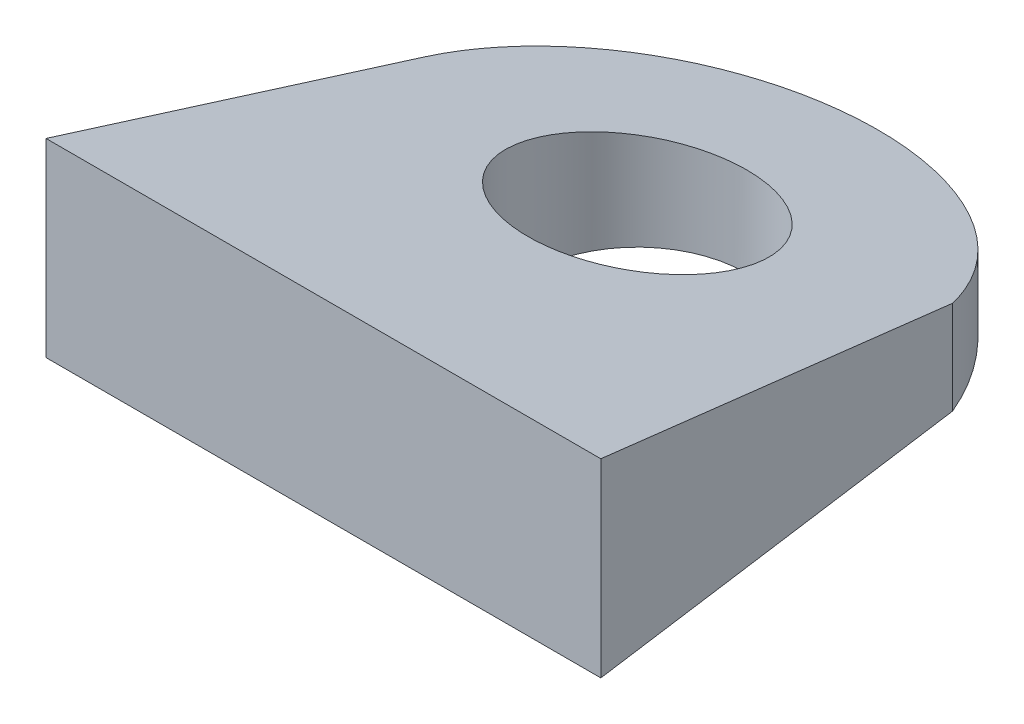
ISO-10303-21;
HEADER;
FILE_DESCRIPTION(('STEP AP214'),'2;1');
FILE_NAME('part.step','',(''),(''),'','','');
FILE_SCHEMA(('AUTOMOTIVE_DESIGN { 1 0 10303 214 1 1 1 1 }'));
ENDSEC;
DATA;
#1=APPLICATION_CONTEXT('core data for automotive mechanical design processes');
#2=APPLICATION_PROTOCOL_DEFINITION('international standard','automotive_design',2000,#1);
#3=PRODUCT_CONTEXT('',#1,'mechanical');
#4=PRODUCT('Part','Part','',(#3));
#5=PRODUCT_RELATED_PRODUCT_CATEGORY('part','',(#4));
#6=PRODUCT_DEFINITION_FORMATION('','',#4);
#7=PRODUCT_DEFINITION_CONTEXT('part definition',#1,'design');
#8=PRODUCT_DEFINITION('design','',#6,#7);
#9=PRODUCT_DEFINITION_SHAPE('','',#8);
#10=(LENGTH_UNIT() NAMED_UNIT(*) SI_UNIT(.MILLI.,.METRE.));
#11=(NAMED_UNIT(*) PLANE_ANGLE_UNIT() SI_UNIT($,.RADIAN.));
#12=(NAMED_UNIT(*) SI_UNIT($,.STERADIAN.) SOLID_ANGLE_UNIT());
#13=UNCERTAINTY_MEASURE_WITH_UNIT(LENGTH_MEASURE(1.E-05),#10,'distance_accuracy_value','');
#14=(GEOMETRIC_REPRESENTATION_CONTEXT(3) GLOBAL_UNCERTAINTY_ASSIGNED_CONTEXT((#13)) GLOBAL_UNIT_ASSIGNED_CONTEXT((#10,
#11,#12)) REPRESENTATION_CONTEXT('',''));
#15=CARTESIAN_POINT('',(0.,0.,0.));
#16=DIRECTION('',(0.,0.,1.));
#17=DIRECTION('',(1.,0.,0.));
#18=AXIS2_PLACEMENT_3D('',#15,#16,#17);
#19=CARTESIAN_POINT('',(0.,0.,-5.461));
#20=DIRECTION('',(0.,-1.,0.));
#21=DIRECTION('',(0.,0.,-1.));
#22=AXIS2_PLACEMENT_3D('',#19,#20,#21);
#23=PLANE('',#22);
#24=DIRECTION('',(-0.134382620945908,0.,-0.990929518779065));
#25=VECTOR('',#24,1.);
#26=CARTESIAN_POINT('',(4.826,0.,0.));
#27=LINE('',#26,#25);
#28=CARTESIAN_POINT('',(4.826,0.,0.));
#29=VERTEX_POINT('',#28);
#30=CARTESIAN_POINT('',(3.8659594078743,0.,-7.07928268750185));
#31=VERTEX_POINT('',#30);
#32=EDGE_CURVE('E241',#29,#31,#27,.T.);
#33=ORIENTED_EDGE('',*,*,#32,.F.);
#34=DIRECTION('',(1.,0.,0.));
#35=VECTOR('',#34,1.);
#36=CARTESIAN_POINT('',(0.,0.,0.));
#37=LINE('',#36,#35);
#38=CARTESIAN_POINT('',(-4.826,0.,0.));
#39=VERTEX_POINT('',#38);
#40=EDGE_CURVE('E245',#39,#29,#37,.T.);
#41=ORIENTED_EDGE('',*,*,#40,.F.);
#42=DIRECTION('',(-0.110834369369704,0.,0.993838891655192));
#43=VECTOR('',#42,1.);
#44=CARTESIAN_POINT('',(-4.826,0.,0.));
#45=LINE('',#44,#43);
#46=CARTESIAN_POINT('',(-4.16517879492691,0.,-5.92550684202843));
#47=VERTEX_POINT('',#46);
#48=EDGE_CURVE('E225',#47,#39,#45,.T.);
#49=ORIENTED_EDGE('',*,*,#48,.F.);
#50=CARTESIAN_POINT('',(0.,0.,-5.461));
#51=DIRECTION('',(0.,1.,0.));
#52=DIRECTION('',(0.,0.,1.));
#53=AXIS2_PLACEMENT_3D('',#50,#51,#52);
#54=CIRCLE('',#53,4.191);
#55=EDGE_CURVE('E234',#31,#47,#54,.T.);
#56=ORIENTED_EDGE('',*,*,#55,.F.);
#57=EDGE_LOOP('',(#33,#41,#49,#56));
#58=FACE_BOUND('',#57,.T.);
#59=CARTESIAN_POINT('',(0.,0.,-5.461));
#60=DIRECTION('',(0.,1.,0.));
#61=DIRECTION('',(0.,0.,1.));
#62=AXIS2_PLACEMENT_3D('',#59,#60,#61);
#63=CIRCLE('',#62,1.905);
#64=CARTESIAN_POINT('',(0.,0.,-3.556));
#65=VERTEX_POINT('',#64);
#66=EDGE_CURVE('E262',#65,#65,#63,.T.);
#67=ORIENTED_EDGE('',*,*,#66,.T.);
#68=EDGE_LOOP('',(#67));
#69=FACE_BOUND('',#68,.T.);
#70=ADVANCED_FACE('F186',(#58,#69),#23,.T.);
#71=CARTESIAN_POINT('',(4.826,3.302,0.));
#72=DIRECTION('',(-0.990929518779064,0.,0.134382620945908));
#73=DIRECTION('',(0.134382620945908,0.,0.990929518779065));
#74=AXIS2_PLACEMENT_3D('',#71,#72,#73);
#75=PLANE('',#74);
#76=DIRECTION('',(0.,-1.,0.));
#77=VECTOR('',#76,1.);
#78=CARTESIAN_POINT('',(3.8659594078743,3.302,-7.07928268750185));
#79=LINE('',#78,#77);
#80=CARTESIAN_POINT('',(3.8659594078743,1.62532778453904,-7.07928268750185));
#81=VERTEX_POINT('',#80);
#82=EDGE_CURVE('E197',#81,#31,#79,.T.);
#83=ORIENTED_EDGE('',*,*,#82,.F.);
#84=DIRECTION('',(0.130827838383835,0.228485548867576,0.964716761885319));
#85=VECTOR('',#84,1.);
#86=CARTESIAN_POINT('',(4.826,3.302,0.));
#87=LINE('',#86,#85);
#88=CARTESIAN_POINT('',(4.826,3.302,0.));
#89=VERTEX_POINT('',#88);
#90=EDGE_CURVE('E268',#81,#89,#87,.T.);
#91=ORIENTED_EDGE('',*,*,#90,.T.);
#92=DIRECTION('',(0.,-1.,0.));
#93=VECTOR('',#92,1.);
#94=CARTESIAN_POINT('',(4.826,3.302,0.));
#95=LINE('',#94,#93);
#96=EDGE_CURVE('E13',#89,#29,#95,.T.);
#97=ORIENTED_EDGE('',*,*,#96,.T.);
#98=ORIENTED_EDGE('',*,*,#32,.T.);
#99=EDGE_LOOP('',(#83,#91,#97,#98));
#100=FACE_BOUND('',#99,.T.);
#101=ADVANCED_FACE('F188',(#100),#75,.F.);
#102=CARTESIAN_POINT('',(0.,3.302,-5.461));
#103=DIRECTION('',(0.,-1.,0.));
#104=DIRECTION('',(0.,0.,-1.));
#105=AXIS2_PLACEMENT_3D('',#102,#103,#104);
#106=CYLINDRICAL_SURFACE('',#105,4.191);
#107=DIRECTION('',(0.,-1.,0.));
#108=VECTOR('',#107,1.);
#109=CARTESIAN_POINT('',(-4.16517879492691,3.302,-5.92550684202843));
#110=LINE('',#109,#108);
#111=CARTESIAN_POINT('',(-4.16517879492691,1.89859048478274,-5.92550684202843));
#112=VERTEX_POINT('',#111);
#113=EDGE_CURVE('E220',#112,#47,#110,.T.);
#114=ORIENTED_EDGE('',*,*,#113,.F.);
#115=CARTESIAN_POINT('',(0.,2.00860526315789,-5.461));
#116=DIRECTION('',(0.,-0.973080287490009,0.230466383879213));
#117=DIRECTION('',(0.,-0.230466383879213,-0.97308028749001));
#118=AXIS2_PLACEMENT_3D('',#115,#116,#117);
#119=ELLIPSE('',#118,4.30694163049011,4.191);
#120=EDGE_CURVE('E271',#112,#81,#119,.T.);
#121=ORIENTED_EDGE('',*,*,#120,.T.);
#122=ORIENTED_EDGE('',*,*,#82,.T.);
#123=ORIENTED_EDGE('',*,*,#55,.T.);
#124=EDGE_LOOP('',(#114,#121,#122,#123));
#125=FACE_BOUND('',#124,.T.);
#126=ADVANCED_FACE('F235',(#125),#106,.T.);
#127=CARTESIAN_POINT('',(-4.826,3.302,0.));
#128=DIRECTION('',(0.993838891655192,0.,0.110834369369704));
#129=DIRECTION('',(0.110834369369704,0.,-0.993838891655192));
#130=AXIS2_PLACEMENT_3D('',#127,#128,#129);
#131=PLANE('',#130);
#132=DIRECTION('',(0.,-1.,0.));
#133=VECTOR('',#132,1.);
#134=CARTESIAN_POINT('',(-4.826,3.302,0.));
#135=LINE('',#134,#133);
#136=CARTESIAN_POINT('',(-4.826,3.302,0.));
#137=VERTEX_POINT('',#136);
#138=EDGE_CURVE('E231',#137,#39,#135,.T.);
#139=ORIENTED_EDGE('',*,*,#138,.F.);
#140=DIRECTION('',(0.107885942210073,-0.229121215683521,-0.967400688441532));
#141=VECTOR('',#140,1.);
#142=CARTESIAN_POINT('',(-4.826,3.302,0.));
#143=LINE('',#142,#141);
#144=EDGE_CURVE('E204',#137,#112,#143,.T.);
#145=ORIENTED_EDGE('',*,*,#144,.T.);
#146=ORIENTED_EDGE('',*,*,#113,.T.);
#147=ORIENTED_EDGE('',*,*,#48,.T.);
#148=EDGE_LOOP('',(#139,#145,#146,#147));
#149=FACE_BOUND('',#148,.T.);
#150=ADVANCED_FACE('F223',(#149),#131,.F.);
#151=CARTESIAN_POINT('',(0.,3.302,0.));
#152=DIRECTION('',(0.,0.,-1.));
#153=DIRECTION('',(-1.,0.,0.));
#154=AXIS2_PLACEMENT_3D('',#151,#152,#153);
#155=PLANE('',#154);
#156=ORIENTED_EDGE('',*,*,#40,.T.);
#157=ORIENTED_EDGE('',*,*,#96,.F.);
#158=DIRECTION('',(1.,0.,0.));
#159=VECTOR('',#158,1.);
#160=CARTESIAN_POINT('',(0.,3.302,0.));
#161=LINE('',#160,#159);
#162=EDGE_CURVE('E249',#137,#89,#161,.T.);
#163=ORIENTED_EDGE('',*,*,#162,.F.);
#164=ORIENTED_EDGE('',*,*,#138,.T.);
#165=EDGE_LOOP('',(#156,#157,#163,#164));
#166=FACE_BOUND('',#165,.T.);
#167=ADVANCED_FACE('F286',(#166),#155,.F.);
#168=CARTESIAN_POINT('',(0.,3.302,-5.461));
#169=DIRECTION('',(0.,-1.,0.));
#170=DIRECTION('',(0.,0.,-1.));
#171=AXIS2_PLACEMENT_3D('',#168,#169,#170);
#172=CYLINDRICAL_SURFACE('',#171,1.905);
#173=CARTESIAN_POINT('',(0.,2.00860526315789,-5.461));
#174=DIRECTION('',(0.,-0.973080287490009,0.230466383879213));
#175=DIRECTION('',(0.,-0.230466383879213,-0.97308028749001));
#176=AXIS2_PLACEMENT_3D('',#173,#174,#175);
#177=ELLIPSE('',#176,1.95770074113187,1.905);
#178=CARTESIAN_POINT('',(0.,1.55742105263158,-7.366));
#179=VERTEX_POINT('',#178);
#180=EDGE_CURVE('E190',#179,#179,#177,.T.);
#181=ORIENTED_EDGE('',*,*,#180,.F.);
#182=EDGE_LOOP('',(#181));
#183=FACE_BOUND('',#182,.T.);
#184=ORIENTED_EDGE('',*,*,#66,.F.);
#185=EDGE_LOOP('',(#184));
#186=FACE_BOUND('',#185,.T.);
#187=ADVANCED_FACE('F283',(#183,#186),#172,.F.);
#188=CARTESIAN_POINT('',(-4.826,3.302,0.));
#189=DIRECTION('',(0.,-0.973080287490009,0.230466383879213));
#190=DIRECTION('',(0.,-0.230466383879213,-0.973080287490009));
#191=AXIS2_PLACEMENT_3D('',#188,#189,#190);
#192=PLANE('',#191);
#193=ORIENTED_EDGE('',*,*,#180,.T.);
#194=EDGE_LOOP('',(#193));
#195=FACE_BOUND('',#194,.T.);
#196=ORIENTED_EDGE('',*,*,#120,.F.);
#197=ORIENTED_EDGE('',*,*,#144,.F.);
#198=ORIENTED_EDGE('',*,*,#162,.T.);
#199=ORIENTED_EDGE('',*,*,#90,.F.);
#200=EDGE_LOOP('',(#196,#197,#198,#199));
#201=FACE_BOUND('',#200,.T.);
#202=ADVANCED_FACE('F281',(#195,#201),#192,.F.);
#203=CLOSED_SHELL('',(#70,#101,#126,#150,#167,#187,#202));
#204=MANIFOLD_SOLID_BREP('B2',#203);
#205=ADVANCED_BREP_SHAPE_REPRESENTATION('',(#18,#204),#14);
#206=SHAPE_DEFINITION_REPRESENTATION(#9,#205);
ENDSEC;
END-ISO-10303-21;
